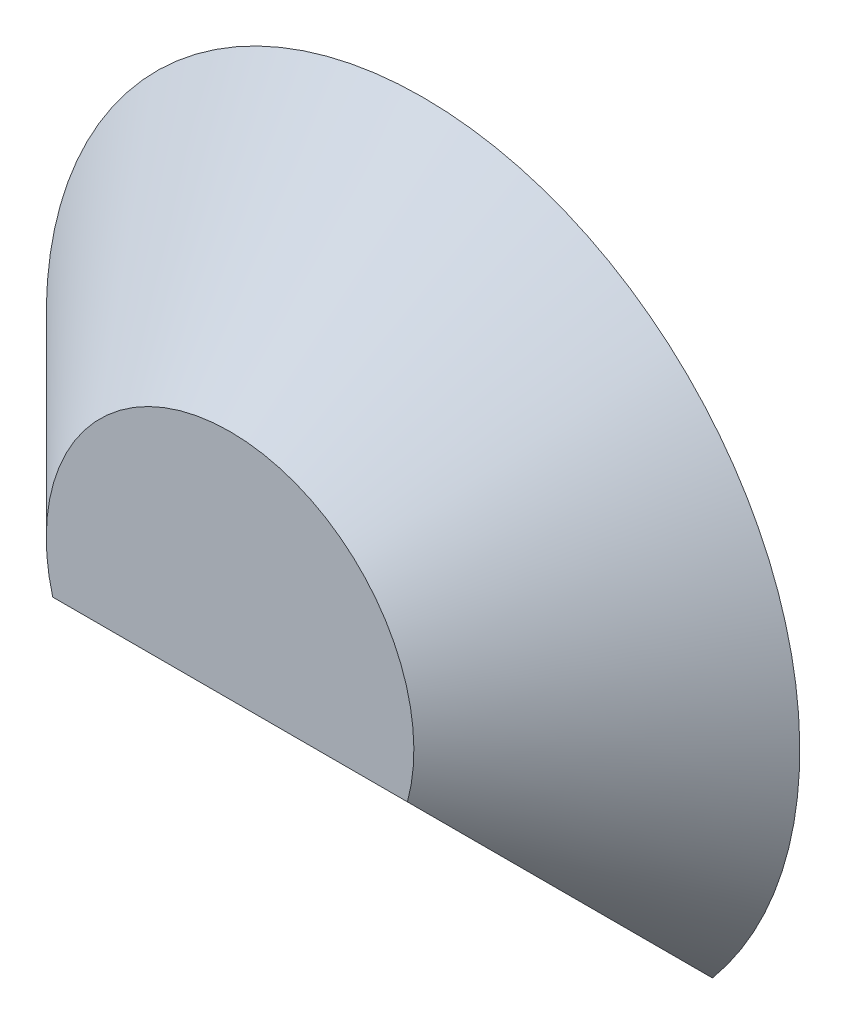
ISO-10303-21;
HEADER;
FILE_DESCRIPTION(('STEP AP214'),'2;1');
FILE_NAME('part.step','',(''),(''),'','','');
FILE_SCHEMA(('AUTOMOTIVE_DESIGN { 1 0 10303 214 1 1 1 1 }'));
ENDSEC;
DATA;
#1=APPLICATION_CONTEXT('core data for automotive mechanical design processes');
#2=APPLICATION_PROTOCOL_DEFINITION('international standard','automotive_design',2000,#1);
#3=PRODUCT_CONTEXT('',#1,'mechanical');
#4=PRODUCT('Part','Part','',(#3));
#5=PRODUCT_RELATED_PRODUCT_CATEGORY('part','',(#4));
#6=PRODUCT_DEFINITION_FORMATION('','',#4);
#7=PRODUCT_DEFINITION_CONTEXT('part definition',#1,'design');
#8=PRODUCT_DEFINITION('design','',#6,#7);
#9=PRODUCT_DEFINITION_SHAPE('','',#8);
#10=(LENGTH_UNIT() NAMED_UNIT(*) SI_UNIT(.MILLI.,.METRE.));
#11=(NAMED_UNIT(*) PLANE_ANGLE_UNIT() SI_UNIT($,.RADIAN.));
#12=(NAMED_UNIT(*) SI_UNIT($,.STERADIAN.) SOLID_ANGLE_UNIT());
#13=UNCERTAINTY_MEASURE_WITH_UNIT(LENGTH_MEASURE(1.E-05),#10,'distance_accuracy_value','');
#14=(GEOMETRIC_REPRESENTATION_CONTEXT(3) GLOBAL_UNCERTAINTY_ASSIGNED_CONTEXT((#13)) GLOBAL_UNIT_ASSIGNED_CONTEXT((#10,
#11,#12)) REPRESENTATION_CONTEXT('',''));
#15=CARTESIAN_POINT('',(0.,0.,0.));
#16=DIRECTION('',(0.,0.,1.));
#17=DIRECTION('',(1.,0.,0.));
#18=AXIS2_PLACEMENT_3D('',#15,#16,#17);
#19=CARTESIAN_POINT('',(0.,0.,0.));
#20=DIRECTION('',(0.,0.,-1.));
#21=DIRECTION('',(-1.,0.,0.));
#22=AXIS2_PLACEMENT_3D('',#19,#20,#21);
#23=CONICAL_SURFACE('',#22,99.1901708840145,0.785398163397449);
#24=CARTESIAN_POINT('',(0.,0.,0.));
#25=DIRECTION('',(0.,0.,1.));
#26=DIRECTION('',(-1.,0.,0.));
#27=AXIS2_PLACEMENT_3D('',#24,#25,#26);
#28=CIRCLE('',#27,99.1901708840145);
#29=CARTESIAN_POINT('',(76.2,-63.5,0.));
#30=VERTEX_POINT('',#29);
#31=CARTESIAN_POINT('',(-76.2,-63.5,0.));
#32=VERTEX_POINT('',#31);
#33=EDGE_CURVE('E107',#30,#32,#28,.T.);
#34=ORIENTED_EDGE('',*,*,#33,.T.);
#35=CARTESIAN_POINT('',(-46.6938822350864,-12.6999999999999,50.8));
#36=CARTESIAN_POINT('',(-47.2589273854115,-13.4392997776889,50.060700222311));
#37=CARTESIAN_POINT('',(-47.8160766438893,-14.1816002436115,49.3183997563884));
#38=CARTESIAN_POINT('',(-48.9156101723121,-15.6716194093135,47.8283805906864));
#39=CARTESIAN_POINT('',(-49.4579949393356,-16.4193379256068,47.0806620743931));
#40=CARTESIAN_POINT('',(-50.5289718491355,-17.9195305578654,45.5804694421345));
#41=CARTESIAN_POINT('',(-51.0575663551091,-18.6720038312005,44.8279961687994));
#42=CARTESIAN_POINT('',(-52.1019638108041,-20.1813788771097,43.3186211228902));
#43=CARTESIAN_POINT('',(-52.6177666384895,-20.9382806918482,42.5617193081518));
#44=CARTESIAN_POINT('',(-54.1465956925178,-23.2140411150241,40.2859588849759));
#45=CARTESIAN_POINT('',(-55.141730529687,-24.7389226853157,38.7610773146842));
#46=CARTESIAN_POINT('',(-57.0899332602285,-27.802105981675,35.697894018325));
#47=CARTESIAN_POINT('',(-58.0429990104598,-29.340408386675,34.159591613325));
#48=CARTESIAN_POINT('',(-59.9096256488375,-32.424975822305,31.0750241776949));
#49=CARTESIAN_POINT('',(-60.8232679807319,-33.9712162449606,29.5287837550394));
#50=CARTESIAN_POINT('',(-62.6170864540619,-37.0733294999445,26.4266705000555));
#51=CARTESIAN_POINT('',(-63.497263088206,-38.6292021900664,24.8707978099336));
#52=CARTESIAN_POINT('',(-65.2275425288954,-41.7495274855778,21.7504725144222));
#53=CARTESIAN_POINT('',(-66.0776410812817,-43.3139812687963,20.1860187312037));
#54=CARTESIAN_POINT('',(-67.7504110167869,-46.450189229757,17.0498107702429));
#55=CARTESIAN_POINT('',(-68.5730825076821,-48.0219433787844,15.4780566212156));
#56=CARTESIAN_POINT('',(-69.9758186127788,-50.7489295308582,12.7510704691418));
#57=CARTESIAN_POINT('',(-70.5617060202133,-51.9026673029085,11.5973326970915));
#58=CARTESIAN_POINT('',(-71.7208611328685,-54.213213828012,9.28678617198798));
#59=CARTESIAN_POINT('',(-72.2941297520724,-55.3700223518033,8.12997764819673));
#60=CARTESIAN_POINT('',(-73.429286231851,-57.6874411945339,5.81255880546607));
#61=CARTESIAN_POINT('',(-73.9911648205484,-58.8480537825556,4.65194621744436));
#62=CARTESIAN_POINT('',(-75.1037817918886,-61.1720350104567,2.32796498954334));
#63=CARTESIAN_POINT('',(-75.6545194087552,-62.3354038336879,1.16459616631211));
#64=CARTESIAN_POINT('',(-76.2,-63.5,0.));
#65=B_SPLINE_CURVE_WITH_KNOTS('',3,(#35,#36,#37,#38,#39,#40,#41,#42,#43,#44,#45,#46,#47,#48,#49,
#50,#51,#52,#53,#54,#55,#56,#57,#58,#59,#60,#61,#62,#63,#64),.UNSPECIFIED.,.F.,.F.,(4,2,2,2,2,2,
2,2,2,2,2,2,2,2,4),(0.,3.56527413055266,7.13042807967972,10.6949670112796,14.2595399364628,
21.3840905297806,28.5090036538024,35.6184141937498,42.7277200227586,49.8380273848036,
56.9483068032207,62.1491580139648,67.3496312774134,72.5541804412305,77.7590861331618),.UNSPECIFIED.);
#66=CARTESIAN_POINT('',(-46.6938822350864,-12.6999999999999,50.8));
#67=VERTEX_POINT('',#66);
#68=EDGE_CURVE('E41',#67,#32,#65,.T.);
#69=ORIENTED_EDGE('',*,*,#68,.F.);
#70=CARTESIAN_POINT('',(0.,0.,50.8));
#71=DIRECTION('',(0.,0.,-1.));
#72=DIRECTION('',(-1.,0.,0.));
#73=AXIS2_PLACEMENT_3D('',#70,#71,#72);
#74=CIRCLE('',#73,48.3901708840144);
#75=CARTESIAN_POINT('',(46.6938822350864,-12.6999999999999,50.8));
#76=VERTEX_POINT('',#75);
#77=EDGE_CURVE('E141',#76,#67,#74,.F.);
#78=ORIENTED_EDGE('',*,*,#77,.F.);
#79=CARTESIAN_POINT('',(46.6938822350864,-12.6999999999999,50.8));
#80=CARTESIAN_POINT('',(47.2589273854116,-13.4392997776889,50.060700222311));
#81=CARTESIAN_POINT('',(47.8160766438893,-14.1816002436115,49.3183997563884));
#82=CARTESIAN_POINT('',(48.9156101723122,-15.6716194093135,47.8283805906864));
#83=CARTESIAN_POINT('',(49.4579949393356,-16.4193379256068,47.0806620743931));
#84=CARTESIAN_POINT('',(50.5289718491356,-17.9195305578654,45.5804694421345));
#85=CARTESIAN_POINT('',(51.0575663551091,-18.6720038312005,44.8279961687994));
#86=CARTESIAN_POINT('',(52.1019638108041,-20.1813788771097,43.3186211228902));
#87=CARTESIAN_POINT('',(52.6177666384896,-20.9382806918482,42.5617193081518));
#88=CARTESIAN_POINT('',(54.1465956925179,-23.2140411150241,40.2859588849759));
#89=CARTESIAN_POINT('',(55.141730529687,-24.7389226853157,38.7610773146842));
#90=CARTESIAN_POINT('',(57.0899332602285,-27.802105981675,35.697894018325));
#91=CARTESIAN_POINT('',(58.0429990104598,-29.340408386675,34.159591613325));
#92=CARTESIAN_POINT('',(59.9096256488375,-32.424975822305,31.0750241776949));
#93=CARTESIAN_POINT('',(60.823267980732,-33.9712162449606,29.5287837550394));
#94=CARTESIAN_POINT('',(62.617086454062,-37.0733294999445,26.4266705000555));
#95=CARTESIAN_POINT('',(63.4972630882061,-38.6292021900664,24.8707978099336));
#96=CARTESIAN_POINT('',(65.2275425288955,-41.7495274855778,21.7504725144222));
#97=CARTESIAN_POINT('',(66.0776410812817,-43.3139812687963,20.1860187312037));
#98=CARTESIAN_POINT('',(67.750411016787,-46.450189229757,17.0498107702429));
#99=CARTESIAN_POINT('',(68.5730825076822,-48.0219433787844,15.4780566212156));
#100=CARTESIAN_POINT('',(69.9758186127789,-50.7489295308582,12.7510704691418));
#101=CARTESIAN_POINT('',(70.5617060202134,-51.9026673029085,11.5973326970915));
#102=CARTESIAN_POINT('',(71.7208611328686,-54.213213828012,9.28678617198798));
#103=CARTESIAN_POINT('',(72.2941297520725,-55.3700223518033,8.12997764819673));
#104=CARTESIAN_POINT('',(73.4292862318511,-57.6874411945339,5.81255880546607));
#105=CARTESIAN_POINT('',(73.9911648205484,-58.8480537825556,4.65194621744436));
#106=CARTESIAN_POINT('',(75.1037817918886,-61.1720350104567,2.32796498954333));
#107=CARTESIAN_POINT('',(75.6545194087553,-62.3354038336879,1.16459616631211));
#108=CARTESIAN_POINT('',(76.2,-63.5,0.));
#109=B_SPLINE_CURVE_WITH_KNOTS('',3,(#79,#80,#81,#82,#83,#84,#85,#86,#87,#88,#89,#90,#91,#92,
#93,#94,#95,#96,#97,#98,#99,#100,#101,#102,#103,#104,#105,#106,#107,#108),.UNSPECIFIED.,.F.,.F.,
(4,2,2,2,2,2,2,2,2,2,2,2,2,2,4),(0.,3.56527413055266,7.13042807967972,10.6949670112796,
14.2595399364628,21.3840905297806,28.5090036538024,35.6184141937498,42.7277200227586,
49.8380273848036,56.9483068032207,62.1491580139648,67.3496312774134,72.5541804412305,
77.7590861331618),.UNSPECIFIED.);
#110=EDGE_CURVE('E134',#76,#30,#109,.T.);
#111=ORIENTED_EDGE('',*,*,#110,.T.);
#112=EDGE_LOOP('',(#34,#69,#78,#111));
#113=FACE_BOUND('',#112,.T.);
#114=ADVANCED_FACE('F33',(#113),#23,.T.);
#115=CARTESIAN_POINT('',(-76.2,-63.5,0.));
#116=DIRECTION('',(0.,-0.707106781186547,0.707106781186548));
#117=DIRECTION('',(0.,-0.707106781186548,-0.707106781186547));
#118=AXIS2_PLACEMENT_3D('',#115,#116,#117);
#119=PLANE('',#118);
#120=CARTESIAN_POINT('',(0.,-45.7015370324326,17.7984629675674));
#121=DIRECTION('',(0.,-0.707106781186547,0.707106781186548));
#122=DIRECTION('',(0.,-0.707106781186548,-0.707106781186547));
#123=AXIS2_PLACEMENT_3D('',#120,#121,#122);
#124=CIRCLE('',#123,19.05);
#125=CARTESIAN_POINT('',(0.,-59.1719212140363,4.32807878596373));
#126=VERTEX_POINT('',#125);
#127=EDGE_CURVE('E88',#126,#126,#124,.T.);
#128=ORIENTED_EDGE('',*,*,#127,.F.);
#129=EDGE_LOOP('',(#128));
#130=FACE_BOUND('',#129,.T.);
#131=DIRECTION('',(1.,0.,0.));
#132=VECTOR('',#131,1.);
#133=CARTESIAN_POINT('',(-76.2,-63.5,0.));
#134=LINE('',#133,#132);
#135=EDGE_CURVE('E143',#32,#30,#134,.T.);
#136=ORIENTED_EDGE('',*,*,#135,.T.);
#137=ORIENTED_EDGE('',*,*,#110,.F.);
#138=DIRECTION('',(-1.,0.,0.));
#139=VECTOR('',#138,1.);
#140=CARTESIAN_POINT('',(0.,-12.6999999999999,50.8));
#141=LINE('',#140,#139);
#142=EDGE_CURVE('E140',#67,#76,#141,.F.);
#143=ORIENTED_EDGE('',*,*,#142,.F.);
#144=ORIENTED_EDGE('',*,*,#68,.T.);
#145=EDGE_LOOP('',(#136,#137,#143,#144));
#146=FACE_BOUND('',#145,.T.);
#147=ADVANCED_FACE('F121',(#130,#146),#119,.T.);
#148=CARTESIAN_POINT('',(0.,0.,50.8));
#149=DIRECTION('',(0.,0.,-1.));
#150=DIRECTION('',(-1.,0.,0.));
#151=AXIS2_PLACEMENT_3D('',#148,#149,#150);
#152=PLANE('',#151);
#153=ORIENTED_EDGE('',*,*,#77,.T.);
#154=ORIENTED_EDGE('',*,*,#142,.T.);
#155=EDGE_LOOP('',(#153,#154));
#156=FACE_BOUND('',#155,.T.);
#157=ADVANCED_FACE('F117',(#156),#152,.F.);
#158=CARTESIAN_POINT('',(0.,0.,0.));
#159=DIRECTION('',(0.,0.,-1.));
#160=DIRECTION('',(-1.,0.,0.));
#161=AXIS2_PLACEMENT_3D('',#158,#159,#160);
#162=PLANE('',#161);
#163=CARTESIAN_POINT('',(0.,-27.9030740648651,0.));
#164=DIRECTION('',(0.,0.,-1.));
#165=DIRECTION('',(0.,-1.,0.));
#166=AXIS2_PLACEMENT_3D('',#163,#164,#165);
#167=ELLIPSE('',#166,26.9407683632074,19.05);
#168=CARTESIAN_POINT('',(10.0383211425255,-50.8,0.));
#169=VERTEX_POINT('',#168);
#170=CARTESIAN_POINT('',(-10.0383211425255,-50.8,0.));
#171=VERTEX_POINT('',#170);
#172=EDGE_CURVE('E47',#169,#171,#167,.T.);
#173=ORIENTED_EDGE('',*,*,#172,.F.);
#174=DIRECTION('',(-1.,0.,0.));
#175=VECTOR('',#174,1.);
#176=CARTESIAN_POINT('',(69.9993547080688,-50.8,0.));
#177=LINE('',#176,#175);
#178=CARTESIAN_POINT('',(69.9993547080688,-50.8,0.));
#179=VERTEX_POINT('',#178);
#180=EDGE_CURVE('E86',#179,#169,#177,.T.);
#181=ORIENTED_EDGE('',*,*,#180,.F.);
#182=CARTESIAN_POINT('',(0.,0.,0.));
#183=DIRECTION('',(0.,0.,-1.));
#184=DIRECTION('',(-1.,0.,0.));
#185=AXIS2_PLACEMENT_3D('',#182,#183,#184);
#186=CIRCLE('',#185,86.4901708840145);
#187=CARTESIAN_POINT('',(-69.9993547080687,-50.8,0.));
#188=VERTEX_POINT('',#187);
#189=EDGE_CURVE('E54',#188,#179,#186,.T.);
#190=ORIENTED_EDGE('',*,*,#189,.F.);
#191=EDGE_CURVE('E87',#171,#188,#177,.T.);
#192=ORIENTED_EDGE('',*,*,#191,.F.);
#193=EDGE_LOOP('',(#173,#181,#190,#192));
#194=FACE_BOUND('',#193,.T.);
#195=ORIENTED_EDGE('',*,*,#33,.F.);
#196=ORIENTED_EDGE('',*,*,#135,.F.);
#197=EDGE_LOOP('',(#195,#196));
#198=FACE_BOUND('',#197,.T.);
#199=ADVANCED_FACE('F84',(#194,#198),#162,.T.);
#200=CARTESIAN_POINT('',(0.,0.,0.));
#201=DIRECTION('',(0.,0.,-1.));
#202=DIRECTION('',(-1.,0.,0.));
#203=AXIS2_PLACEMENT_3D('',#200,#201,#202);
#204=CONICAL_SURFACE('',#203,86.4901708840145,0.785398163397449);
#205=ORIENTED_EDGE('',*,*,#189,.T.);
#206=CARTESIAN_POINT('',(40.4524465751052,-5.07999999999993,45.72));
#207=CARTESIAN_POINT('',(40.9835696750452,-5.68203198740529,45.1179680125946));
#208=CARTESIAN_POINT('',(41.5071994022296,-6.28734931736732,44.5126506826326));
#209=CARTESIAN_POINT('',(42.540422198225,-7.50390929140739,43.2960907085926));
#210=CARTESIAN_POINT('',(43.0500159140876,-8.11515166058261,42.6848483394173));
#211=CARTESIAN_POINT('',(44.0560469166171,-9.34282716881391,41.457172831186));
#212=CARTESIAN_POINT('',(44.5524872799092,-9.95925904876625,40.8407409512337));
#213=CARTESIAN_POINT('',(45.5331856422908,-11.1969528725579,39.603047127442));
#214=CARTESIAN_POINT('',(46.0174434823137,-11.8182148793255,38.9817851206744));
#215=CARTESIAN_POINT('',(47.4522797848259,-13.6874552767675,37.1125447232325));
#216=CARTESIAN_POINT('',(48.3858187871777,-14.9419888153943,35.8580111846056));
#217=CARTESIAN_POINT('',(50.2127923596661,-17.4656238033984,33.3343761966016));
#218=CARTESIAN_POINT('',(51.1062241303789,-18.7347262619247,32.0652737380753));
#219=CARTESIAN_POINT('',(52.8547337267298,-21.2813861495596,29.5186138504403));
#220=CARTESIAN_POINT('',(53.7099178500669,-22.5589071432793,28.2410928567207));
#221=CARTESIAN_POINT('',(55.3884055149124,-25.1243260936566,25.6756739063434));
#222=CARTESIAN_POINT('',(56.211709722367,-26.4122238328725,24.3877761671274));
#223=CARTESIAN_POINT('',(57.8297384383379,-28.9972804630217,21.8027195369783));
#224=CARTESIAN_POINT('',(58.6244568052501,-30.2944412732011,20.5055587267988));
#225=CARTESIAN_POINT('',(60.1877830161755,-32.8965922592558,17.9034077407442));
#226=CARTESIAN_POINT('',(60.9563909261989,-34.2015824153278,16.5984175846722));
#227=CARTESIAN_POINT('',(62.4430900467893,-36.7722861969702,14.0277138030298));
#228=CARTESIAN_POINT('',(63.1620068313631,-38.0377614118459,12.762238588154));
#229=CARTESIAN_POINT('',(64.5793707811242,-40.5742631636144,10.2257368363856));
#230=CARTESIAN_POINT('',(65.277820213503,-41.8452890675922,8.9547109324078));
#231=CARTESIAN_POINT('',(66.6568778359601,-44.394220661141,6.40577933885899));
#232=CARTESIAN_POINT('',(67.337459472066,-45.6721335258187,5.12786647418127));
#233=CARTESIAN_POINT('',(68.6811742031067,-48.2326810466951,2.56731895330491));
#234=CARTESIAN_POINT('',(69.3443055945619,-49.5153161500458,1.28468384995419));
#235=CARTESIAN_POINT('',(69.9993547080688,-50.8,0.));
#236=B_SPLINE_CURVE_WITH_KNOTS('',3,(#206,#207,#208,#209,#210,#211,#212,#213,#214,#215,#216,
#217,#218,#219,#220,#221,#222,#223,#224,#225,#226,#227,#228,#229,#230,#231,#232,#233,#234,#235),
.UNSPECIFIED.,.F.,.F.,(4,2,2,2,2,2,2,2,2,2,2,2,2,2,4),(0.,3.01037282668301,6.02060664394936,
9.03013002499522,12.0396926808799,18.0534285910788,24.0675836003245,30.063827903229,
36.0599468816934,42.0573465103851,48.0547309758382,53.8405511587974,59.625727998532,
65.4190646338891,71.2129647279537),.UNSPECIFIED.);
#237=CARTESIAN_POINT('',(40.4524465751052,-5.07999999999993,45.72));
#238=VERTEX_POINT('',#237);
#239=EDGE_CURVE('E92',#238,#179,#236,.T.);
#240=ORIENTED_EDGE('',*,*,#239,.F.);
#241=CARTESIAN_POINT('',(0.,0.,45.72));
#242=DIRECTION('',(0.,0.,-1.));
#243=DIRECTION('',(-1.,0.,0.));
#244=AXIS2_PLACEMENT_3D('',#241,#242,#243);
#245=CIRCLE('',#244,40.7701708840144);
#246=CARTESIAN_POINT('',(-40.4524465751051,-5.07999999999993,45.72));
#247=VERTEX_POINT('',#246);
#248=EDGE_CURVE('E93',#247,#238,#245,.T.);
#249=ORIENTED_EDGE('',*,*,#248,.F.);
#250=CARTESIAN_POINT('',(-40.4524465751051,-5.07999999999993,45.72));
#251=CARTESIAN_POINT('',(-40.9835696750452,-5.68203198740529,45.1179680125946));
#252=CARTESIAN_POINT('',(-41.5071994022295,-6.28734931736732,44.5126506826326));
#253=CARTESIAN_POINT('',(-42.5404221982249,-7.50390929140739,43.2960907085926));
#254=CARTESIAN_POINT('',(-43.0500159140875,-8.11515166058261,42.6848483394173));
#255=CARTESIAN_POINT('',(-44.056046916617,-9.34282716881391,41.457172831186));
#256=CARTESIAN_POINT('',(-44.5524872799091,-9.95925904876625,40.8407409512337));
#257=CARTESIAN_POINT('',(-45.5331856422908,-11.1969528725579,39.603047127442));
#258=CARTESIAN_POINT('',(-46.0174434823136,-11.8182148793255,38.9817851206744));
#259=CARTESIAN_POINT('',(-47.4522797848258,-13.6874552767675,37.1125447232325));
#260=CARTESIAN_POINT('',(-48.3858187871776,-14.9419888153943,35.8580111846056));
#261=CARTESIAN_POINT('',(-50.212792359666,-17.4656238033984,33.3343761966016));
#262=CARTESIAN_POINT('',(-51.1062241303788,-18.7347262619247,32.0652737380753));
#263=CARTESIAN_POINT('',(-52.8547337267298,-21.2813861495596,29.5186138504403));
#264=CARTESIAN_POINT('',(-53.7099178500669,-22.5589071432793,28.2410928567207));
#265=CARTESIAN_POINT('',(-55.3884055149124,-25.1243260936566,25.6756739063434));
#266=CARTESIAN_POINT('',(-56.2117097223669,-26.4122238328725,24.3877761671274));
#267=CARTESIAN_POINT('',(-57.8297384383378,-28.9972804630217,21.8027195369783));
#268=CARTESIAN_POINT('',(-58.62445680525,-30.2944412732011,20.5055587267988));
#269=CARTESIAN_POINT('',(-60.1877830161754,-32.8965922592558,17.9034077407442));
#270=CARTESIAN_POINT('',(-60.9563909261988,-34.2015824153278,16.5984175846722));
#271=CARTESIAN_POINT('',(-62.4430900467892,-36.7722861969702,14.0277138030298));
#272=CARTESIAN_POINT('',(-63.1620068313631,-38.0377614118459,12.762238588154));
#273=CARTESIAN_POINT('',(-64.5793707811242,-40.5742631636144,10.2257368363856));
#274=CARTESIAN_POINT('',(-65.277820213503,-41.8452890675922,8.9547109324078));
#275=CARTESIAN_POINT('',(-66.6568778359601,-44.394220661141,6.40577933885899));
#276=CARTESIAN_POINT('',(-67.337459472066,-45.6721335258187,5.12786647418127));
#277=CARTESIAN_POINT('',(-68.6811742031066,-48.2326810466951,2.56731895330491));
#278=CARTESIAN_POINT('',(-69.3443055945619,-49.5153161500458,1.28468384995419));
#279=CARTESIAN_POINT('',(-69.9993547080687,-50.8,0.));
#280=B_SPLINE_CURVE_WITH_KNOTS('',3,(#250,#251,#252,#253,#254,#255,#256,#257,#258,#259,#260,
#261,#262,#263,#264,#265,#266,#267,#268,#269,#270,#271,#272,#273,#274,#275,#276,#277,#278,#279),
.UNSPECIFIED.,.F.,.F.,(4,2,2,2,2,2,2,2,2,2,2,2,2,2,4),(0.,3.01037282668301,6.02060664394936,
9.03013002499522,12.0396926808799,18.0534285910788,24.0675836003245,30.063827903229,
36.0599468816934,42.0573465103851,48.0547309758382,53.8405511587974,59.625727998532,
65.4190646338891,71.2129647279537),.UNSPECIFIED.);
#281=EDGE_CURVE('E100',#247,#188,#280,.T.);
#282=ORIENTED_EDGE('',*,*,#281,.T.);
#283=EDGE_LOOP('',(#205,#240,#249,#282));
#284=FACE_BOUND('',#283,.T.);
#285=ADVANCED_FACE('F113',(#284),#204,.F.);
#286=CARTESIAN_POINT('',(69.9993547080688,-50.8,0.));
#287=DIRECTION('',(0.,-0.707106781186547,0.707106781186548));
#288=DIRECTION('',(0.,-0.707106781186548,-0.707106781186547));
#289=AXIS2_PLACEMENT_3D('',#286,#287,#288);
#290=PLANE('',#289);
#291=ORIENTED_EDGE('',*,*,#180,.T.);
#292=CARTESIAN_POINT('',(0.,-39.3515370324326,11.4484629675674));
#293=DIRECTION('',(0.,-0.707106781186547,0.707106781186548));
#294=DIRECTION('',(0.,-0.707106781186548,-0.707106781186547));
#295=AXIS2_PLACEMENT_3D('',#292,#293,#294);
#296=CIRCLE('',#295,19.05);
#297=EDGE_CURVE('E11',#169,#171,#296,.T.);
#298=ORIENTED_EDGE('',*,*,#297,.T.);
#299=ORIENTED_EDGE('',*,*,#191,.T.);
#300=ORIENTED_EDGE('',*,*,#281,.F.);
#301=DIRECTION('',(-1.,0.,0.));
#302=VECTOR('',#301,1.);
#303=CARTESIAN_POINT('',(0.,-5.07999999999994,45.72));
#304=LINE('',#303,#302);
#305=EDGE_CURVE('E96',#238,#247,#304,.T.);
#306=ORIENTED_EDGE('',*,*,#305,.F.);
#307=ORIENTED_EDGE('',*,*,#239,.T.);
#308=EDGE_LOOP('',(#291,#298,#299,#300,#306,#307));
#309=FACE_BOUND('',#308,.T.);
#310=ADVANCED_FACE('F90',(#309),#290,.F.);
#311=CARTESIAN_POINT('',(0.,0.,45.72));
#312=DIRECTION('',(0.,0.,-1.));
#313=DIRECTION('',(-1.,0.,0.));
#314=AXIS2_PLACEMENT_3D('',#311,#312,#313);
#315=PLANE('',#314);
#316=ORIENTED_EDGE('',*,*,#248,.T.);
#317=ORIENTED_EDGE('',*,*,#305,.T.);
#318=EDGE_LOOP('',(#316,#317));
#319=FACE_BOUND('',#318,.T.);
#320=ADVANCED_FACE('F156',(#319),#315,.T.);
#321=CARTESIAN_POINT('',(0.,35.6435484095746,-63.5466224744398));
#322=DIRECTION('',(0.,-0.707106781186547,0.707106781186548));
#323=DIRECTION('',(0.,-0.707106781186548,-0.707106781186547));
#324=AXIS2_PLACEMENT_3D('',#321,#322,#323);
#325=CYLINDRICAL_SURFACE('',#324,19.05);
#326=ORIENTED_EDGE('',*,*,#172,.T.);
#327=ORIENTED_EDGE('',*,*,#297,.F.);
#328=EDGE_LOOP('',(#326,#327));
#329=FACE_BOUND('',#328,.T.);
#330=ORIENTED_EDGE('',*,*,#127,.T.);
#331=EDGE_LOOP('',(#330));
#332=FACE_BOUND('',#331,.T.);
#333=ADVANCED_FACE('F77',(#329,#332),#325,.F.);
#334=CLOSED_SHELL('',(#114,#147,#157,#199,#285,#310,#320,#333));
#335=MANIFOLD_SOLID_BREP('B2',#334);
#336=ADVANCED_BREP_SHAPE_REPRESENTATION('',(#18,#335),#14);
#337=SHAPE_DEFINITION_REPRESENTATION(#9,#336);
ENDSEC;
END-ISO-10303-21;
